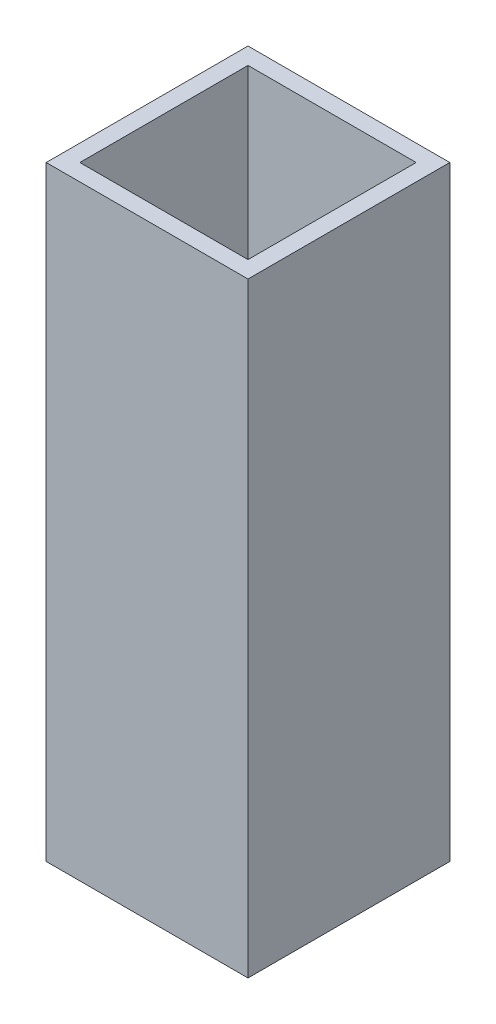
ISO-10303-21;
HEADER;
FILE_DESCRIPTION(('STEP AP214'),'2;1');
FILE_NAME('part.step','',(''),(''),'','','');
FILE_SCHEMA(('AUTOMOTIVE_DESIGN { 1 0 10303 214 1 1 1 1 }'));
ENDSEC;
DATA;
#1=APPLICATION_CONTEXT('core data for automotive mechanical design processes');
#2=APPLICATION_PROTOCOL_DEFINITION('international standard','automotive_design',2000,#1);
#3=PRODUCT_CONTEXT('',#1,'mechanical');
#4=PRODUCT('Part','Part','',(#3));
#5=PRODUCT_RELATED_PRODUCT_CATEGORY('part','',(#4));
#6=PRODUCT_DEFINITION_FORMATION('','',#4);
#7=PRODUCT_DEFINITION_CONTEXT('part definition',#1,'design');
#8=PRODUCT_DEFINITION('design','',#6,#7);
#9=PRODUCT_DEFINITION_SHAPE('','',#8);
#10=(LENGTH_UNIT() NAMED_UNIT(*) SI_UNIT(.MILLI.,.METRE.));
#11=(NAMED_UNIT(*) PLANE_ANGLE_UNIT() SI_UNIT($,.RADIAN.));
#12=(NAMED_UNIT(*) SI_UNIT($,.STERADIAN.) SOLID_ANGLE_UNIT());
#13=UNCERTAINTY_MEASURE_WITH_UNIT(LENGTH_MEASURE(1.E-05),#10,'distance_accuracy_value','');
#14=(GEOMETRIC_REPRESENTATION_CONTEXT(3) GLOBAL_UNCERTAINTY_ASSIGNED_CONTEXT((#13)) GLOBAL_UNIT_ASSIGNED_CONTEXT((#10,
#11,#12)) REPRESENTATION_CONTEXT('',''));
#15=CARTESIAN_POINT('',(0.,0.,0.));
#16=DIRECTION('',(0.,0.,1.));
#17=DIRECTION('',(1.,0.,0.));
#18=AXIS2_PLACEMENT_3D('',#15,#16,#17);
#19=CARTESIAN_POINT('',(76.2,228.6,0.));
#20=DIRECTION('',(0.,-1.,0.));
#21=DIRECTION('',(0.,0.,-1.));
#22=AXIS2_PLACEMENT_3D('',#19,#20,#21);
#23=PLANE('',#22);
#24=DIRECTION('',(0.,0.,1.));
#25=VECTOR('',#24,1.);
#26=CARTESIAN_POINT('',(0.,228.6,0.));
#27=LINE('',#26,#25);
#28=CARTESIAN_POINT('',(0.,228.6,-76.2));
#29=VERTEX_POINT('',#28);
#30=CARTESIAN_POINT('',(0.,228.6,0.));
#31=VERTEX_POINT('',#30);
#32=EDGE_CURVE('E83',#29,#31,#27,.T.);
#33=ORIENTED_EDGE('',*,*,#32,.T.);
#34=DIRECTION('',(-1.,0.,0.));
#35=VECTOR('',#34,1.);
#36=CARTESIAN_POINT('',(76.2,228.6,0.));
#37=LINE('',#36,#35);
#38=CARTESIAN_POINT('',(76.2,228.6,0.));
#39=VERTEX_POINT('',#38);
#40=EDGE_CURVE('E155',#39,#31,#37,.T.);
#41=ORIENTED_EDGE('',*,*,#40,.F.);
#42=DIRECTION('',(0.,0.,1.));
#43=VECTOR('',#42,1.);
#44=CARTESIAN_POINT('',(76.2,228.6,0.));
#45=LINE('',#44,#43);
#46=CARTESIAN_POINT('',(76.2,228.6,-76.2));
#47=VERTEX_POINT('',#46);
#48=EDGE_CURVE('E62',#47,#39,#45,.T.);
#49=ORIENTED_EDGE('',*,*,#48,.F.);
#50=DIRECTION('',(-1.,0.,0.));
#51=VECTOR('',#50,1.);
#52=CARTESIAN_POINT('',(76.2,228.6,-76.2));
#53=LINE('',#52,#51);
#54=EDGE_CURVE('E165',#47,#29,#53,.T.);
#55=ORIENTED_EDGE('',*,*,#54,.T.);
#56=EDGE_LOOP('',(#33,#41,#49,#55));
#57=FACE_BOUND('',#56,.T.);
#58=DIRECTION('',(0.,0.,1.));
#59=VECTOR('',#58,1.);
#60=CARTESIAN_POINT('',(6.35,228.6,0.));
#61=LINE('',#60,#59);
#62=CARTESIAN_POINT('',(6.35,228.6,-69.85));
#63=VERTEX_POINT('',#62);
#64=CARTESIAN_POINT('',(6.35,228.6,-6.35));
#65=VERTEX_POINT('',#64);
#66=EDGE_CURVE('E136',#63,#65,#61,.T.);
#67=ORIENTED_EDGE('',*,*,#66,.F.);
#68=DIRECTION('',(-1.,0.,0.));
#69=VECTOR('',#68,1.);
#70=CARTESIAN_POINT('',(76.2,228.6,-69.85));
#71=LINE('',#70,#69);
#72=CARTESIAN_POINT('',(69.85,228.6,-69.85));
#73=VERTEX_POINT('',#72);
#74=EDGE_CURVE('E131',#73,#63,#71,.T.);
#75=ORIENTED_EDGE('',*,*,#74,.F.);
#76=DIRECTION('',(0.,0.,1.));
#77=VECTOR('',#76,1.);
#78=CARTESIAN_POINT('',(69.85,228.6,0.));
#79=LINE('',#78,#77);
#80=CARTESIAN_POINT('',(69.85,228.6,-6.35));
#81=VERTEX_POINT('',#80);
#82=EDGE_CURVE('E53',#73,#81,#79,.T.);
#83=ORIENTED_EDGE('',*,*,#82,.T.);
#84=DIRECTION('',(-1.,0.,0.));
#85=VECTOR('',#84,1.);
#86=CARTESIAN_POINT('',(76.2,228.6,-6.35));
#87=LINE('',#86,#85);
#88=EDGE_CURVE('E144',#81,#65,#87,.T.);
#89=ORIENTED_EDGE('',*,*,#88,.T.);
#90=EDGE_LOOP('',(#67,#75,#83,#89));
#91=FACE_BOUND('',#90,.T.);
#92=ADVANCED_FACE('F38',(#57,#91),#23,.F.);
#93=CARTESIAN_POINT('',(76.2,0.,0.));
#94=DIRECTION('',(0.,0.,-1.));
#95=DIRECTION('',(-1.,0.,0.));
#96=AXIS2_PLACEMENT_3D('',#93,#94,#95);
#97=PLANE('',#96);
#98=DIRECTION('',(0.,-1.,0.));
#99=VECTOR('',#98,1.);
#100=CARTESIAN_POINT('',(0.,0.,0.));
#101=LINE('',#100,#99);
#102=CARTESIAN_POINT('',(0.,0.,0.));
#103=VERTEX_POINT('',#102);
#104=EDGE_CURVE('E156',#31,#103,#101,.T.);
#105=ORIENTED_EDGE('',*,*,#104,.T.);
#106=DIRECTION('',(-1.,0.,0.));
#107=VECTOR('',#106,1.);
#108=CARTESIAN_POINT('',(76.2,0.,0.));
#109=LINE('',#108,#107);
#110=CARTESIAN_POINT('',(76.2,0.,0.));
#111=VERTEX_POINT('',#110);
#112=EDGE_CURVE('E11',#111,#103,#109,.T.);
#113=ORIENTED_EDGE('',*,*,#112,.F.);
#114=DIRECTION('',(0.,-1.,0.));
#115=VECTOR('',#114,1.);
#116=CARTESIAN_POINT('',(76.2,0.,0.));
#117=LINE('',#116,#115);
#118=EDGE_CURVE('E149',#39,#111,#117,.T.);
#119=ORIENTED_EDGE('',*,*,#118,.F.);
#120=ORIENTED_EDGE('',*,*,#40,.T.);
#121=EDGE_LOOP('',(#105,#113,#119,#120));
#122=FACE_BOUND('',#121,.T.);
#123=ADVANCED_FACE('F40',(#122),#97,.F.);
#124=CARTESIAN_POINT('',(76.2,0.,0.));
#125=DIRECTION('',(0.,1.,0.));
#126=DIRECTION('',(0.,0.,1.));
#127=AXIS2_PLACEMENT_3D('',#124,#125,#126);
#128=PLANE('',#127);
#129=DIRECTION('',(0.,0.,-1.));
#130=VECTOR('',#129,1.);
#131=CARTESIAN_POINT('',(0.,0.,0.));
#132=LINE('',#131,#130);
#133=CARTESIAN_POINT('',(0.,0.,-76.2));
#134=VERTEX_POINT('',#133);
#135=EDGE_CURVE('E159',#103,#134,#132,.T.);
#136=ORIENTED_EDGE('',*,*,#135,.T.);
#137=DIRECTION('',(-1.,0.,0.));
#138=VECTOR('',#137,1.);
#139=CARTESIAN_POINT('',(76.2,0.,-76.2));
#140=LINE('',#139,#138);
#141=CARTESIAN_POINT('',(76.2,0.,-76.2));
#142=VERTEX_POINT('',#141);
#143=EDGE_CURVE('E46',#142,#134,#140,.T.);
#144=ORIENTED_EDGE('',*,*,#143,.F.);
#145=DIRECTION('',(0.,0.,-1.));
#146=VECTOR('',#145,1.);
#147=CARTESIAN_POINT('',(76.2,0.,0.));
#148=LINE('',#147,#146);
#149=EDGE_CURVE('E90',#111,#142,#148,.T.);
#150=ORIENTED_EDGE('',*,*,#149,.F.);
#151=ORIENTED_EDGE('',*,*,#112,.T.);
#152=EDGE_LOOP('',(#136,#144,#150,#151));
#153=FACE_BOUND('',#152,.T.);
#154=ADVANCED_FACE('F204',(#153),#128,.F.);
#155=CARTESIAN_POINT('',(76.2,0.,-76.2));
#156=DIRECTION('',(0.,0.,1.));
#157=DIRECTION('',(1.,0.,0.));
#158=AXIS2_PLACEMENT_3D('',#155,#156,#157);
#159=PLANE('',#158);
#160=DIRECTION('',(0.,1.,0.));
#161=VECTOR('',#160,1.);
#162=CARTESIAN_POINT('',(0.,0.,-76.2));
#163=LINE('',#162,#161);
#164=EDGE_CURVE('E161',#134,#29,#163,.T.);
#165=ORIENTED_EDGE('',*,*,#164,.T.);
#166=ORIENTED_EDGE('',*,*,#54,.F.);
#167=DIRECTION('',(0.,1.,0.));
#168=VECTOR('',#167,1.);
#169=CARTESIAN_POINT('',(76.2,0.,-76.2));
#170=LINE('',#169,#168);
#171=EDGE_CURVE('E152',#142,#47,#170,.T.);
#172=ORIENTED_EDGE('',*,*,#171,.F.);
#173=ORIENTED_EDGE('',*,*,#143,.T.);
#174=EDGE_LOOP('',(#165,#166,#172,#173));
#175=FACE_BOUND('',#174,.T.);
#176=ADVANCED_FACE('F170',(#175),#159,.F.);
#177=CARTESIAN_POINT('',(76.2,0.,0.));
#178=DIRECTION('',(-1.,0.,0.));
#179=DIRECTION('',(0.,0.,1.));
#180=AXIS2_PLACEMENT_3D('',#177,#178,#179);
#181=PLANE('',#180);
#182=ORIENTED_EDGE('',*,*,#118,.T.);
#183=ORIENTED_EDGE('',*,*,#149,.T.);
#184=ORIENTED_EDGE('',*,*,#171,.T.);
#185=ORIENTED_EDGE('',*,*,#48,.T.);
#186=EDGE_LOOP('',(#182,#183,#184,#185));
#187=FACE_BOUND('',#186,.T.);
#188=ADVANCED_FACE('F198',(#187),#181,.F.);
#189=CARTESIAN_POINT('',(0.,0.,0.));
#190=DIRECTION('',(-1.,0.,0.));
#191=DIRECTION('',(0.,0.,1.));
#192=AXIS2_PLACEMENT_3D('',#189,#190,#191);
#193=PLANE('',#192);
#194=ORIENTED_EDGE('',*,*,#104,.F.);
#195=ORIENTED_EDGE('',*,*,#32,.F.);
#196=ORIENTED_EDGE('',*,*,#164,.F.);
#197=ORIENTED_EDGE('',*,*,#135,.F.);
#198=EDGE_LOOP('',(#194,#195,#196,#197));
#199=FACE_BOUND('',#198,.T.);
#200=ADVANCED_FACE('F174',(#199),#193,.T.);
#201=CARTESIAN_POINT('',(76.2,0.,-6.35));
#202=DIRECTION('',(0.,0.,-1.));
#203=DIRECTION('',(-1.,0.,0.));
#204=AXIS2_PLACEMENT_3D('',#201,#202,#203);
#205=PLANE('',#204);
#206=DIRECTION('',(0.,-1.,0.));
#207=VECTOR('',#206,1.);
#208=CARTESIAN_POINT('',(6.35,0.,-6.35));
#209=LINE('',#208,#207);
#210=CARTESIAN_POINT('',(6.35,6.35,-6.35));
#211=VERTEX_POINT('',#210);
#212=EDGE_CURVE('E120',#65,#211,#209,.T.);
#213=ORIENTED_EDGE('',*,*,#212,.F.);
#214=ORIENTED_EDGE('',*,*,#88,.F.);
#215=DIRECTION('',(0.,-1.,0.));
#216=VECTOR('',#215,1.);
#217=CARTESIAN_POINT('',(69.85,0.,-6.35));
#218=LINE('',#217,#216);
#219=CARTESIAN_POINT('',(69.85,6.35,-6.35));
#220=VERTEX_POINT('',#219);
#221=EDGE_CURVE('E138',#81,#220,#218,.T.);
#222=ORIENTED_EDGE('',*,*,#221,.T.);
#223=DIRECTION('',(-1.,0.,0.));
#224=VECTOR('',#223,1.);
#225=CARTESIAN_POINT('',(76.2,6.35,-6.35));
#226=LINE('',#225,#224);
#227=EDGE_CURVE('E130',#220,#211,#226,.T.);
#228=ORIENTED_EDGE('',*,*,#227,.T.);
#229=EDGE_LOOP('',(#213,#214,#222,#228));
#230=FACE_BOUND('',#229,.T.);
#231=ADVANCED_FACE('F182',(#230),#205,.T.);
#232=CARTESIAN_POINT('',(76.2,6.35,0.));
#233=DIRECTION('',(0.,1.,0.));
#234=DIRECTION('',(0.,0.,1.));
#235=AXIS2_PLACEMENT_3D('',#232,#233,#234);
#236=PLANE('',#235);
#237=DIRECTION('',(0.,0.,-1.));
#238=VECTOR('',#237,1.);
#239=CARTESIAN_POINT('',(6.35,6.35,0.));
#240=LINE('',#239,#238);
#241=CARTESIAN_POINT('',(6.35,6.35,-69.85));
#242=VERTEX_POINT('',#241);
#243=EDGE_CURVE('E113',#211,#242,#240,.T.);
#244=ORIENTED_EDGE('',*,*,#243,.F.);
#245=ORIENTED_EDGE('',*,*,#227,.F.);
#246=DIRECTION('',(0.,0.,-1.));
#247=VECTOR('',#246,1.);
#248=CARTESIAN_POINT('',(69.85,6.35,0.));
#249=LINE('',#248,#247);
#250=CARTESIAN_POINT('',(69.85,6.35,-69.85));
#251=VERTEX_POINT('',#250);
#252=EDGE_CURVE('E128',#220,#251,#249,.T.);
#253=ORIENTED_EDGE('',*,*,#252,.T.);
#254=DIRECTION('',(-1.,0.,0.));
#255=VECTOR('',#254,1.);
#256=CARTESIAN_POINT('',(76.2,6.35,-69.85));
#257=LINE('',#256,#255);
#258=EDGE_CURVE('E126',#251,#242,#257,.T.);
#259=ORIENTED_EDGE('',*,*,#258,.T.);
#260=EDGE_LOOP('',(#244,#245,#253,#259));
#261=FACE_BOUND('',#260,.T.);
#262=ADVANCED_FACE('F127',(#261),#236,.T.);
#263=CARTESIAN_POINT('',(76.2,0.,-69.85));
#264=DIRECTION('',(0.,0.,1.));
#265=DIRECTION('',(1.,0.,0.));
#266=AXIS2_PLACEMENT_3D('',#263,#264,#265);
#267=PLANE('',#266);
#268=DIRECTION('',(0.,1.,0.));
#269=VECTOR('',#268,1.);
#270=CARTESIAN_POINT('',(6.35,0.,-69.85));
#271=LINE('',#270,#269);
#272=EDGE_CURVE('E117',#242,#63,#271,.T.);
#273=ORIENTED_EDGE('',*,*,#272,.F.);
#274=ORIENTED_EDGE('',*,*,#258,.F.);
#275=DIRECTION('',(0.,1.,0.));
#276=VECTOR('',#275,1.);
#277=CARTESIAN_POINT('',(69.85,0.,-69.85));
#278=LINE('',#277,#276);
#279=EDGE_CURVE('E142',#251,#73,#278,.T.);
#280=ORIENTED_EDGE('',*,*,#279,.T.);
#281=ORIENTED_EDGE('',*,*,#74,.T.);
#282=EDGE_LOOP('',(#273,#274,#280,#281));
#283=FACE_BOUND('',#282,.T.);
#284=ADVANCED_FACE('F133',(#283),#267,.T.);
#285=CARTESIAN_POINT('',(69.85,0.,0.));
#286=DIRECTION('',(-1.,0.,0.));
#287=DIRECTION('',(0.,0.,1.));
#288=AXIS2_PLACEMENT_3D('',#285,#286,#287);
#289=PLANE('',#288);
#290=ORIENTED_EDGE('',*,*,#221,.F.);
#291=ORIENTED_EDGE('',*,*,#82,.F.);
#292=ORIENTED_EDGE('',*,*,#279,.F.);
#293=ORIENTED_EDGE('',*,*,#252,.F.);
#294=EDGE_LOOP('',(#290,#291,#292,#293));
#295=FACE_BOUND('',#294,.T.);
#296=ADVANCED_FACE('F187',(#295),#289,.T.);
#297=CARTESIAN_POINT('',(6.35,0.,0.));
#298=DIRECTION('',(-1.,0.,0.));
#299=DIRECTION('',(0.,0.,1.));
#300=AXIS2_PLACEMENT_3D('',#297,#298,#299);
#301=PLANE('',#300);
#302=ORIENTED_EDGE('',*,*,#212,.T.);
#303=ORIENTED_EDGE('',*,*,#243,.T.);
#304=ORIENTED_EDGE('',*,*,#272,.T.);
#305=ORIENTED_EDGE('',*,*,#66,.T.);
#306=EDGE_LOOP('',(#302,#303,#304,#305));
#307=FACE_BOUND('',#306,.T.);
#308=ADVANCED_FACE('F115',(#307),#301,.F.);
#309=CLOSED_SHELL('',(#92,#123,#154,#176,#188,#200,#231,#262,#284,#296,#308));
#310=MANIFOLD_SOLID_BREP('B2',#309);
#311=ADVANCED_BREP_SHAPE_REPRESENTATION('',(#18,#310),#14);
#312=SHAPE_DEFINITION_REPRESENTATION(#9,#311);
ENDSEC;
END-ISO-10303-21;
